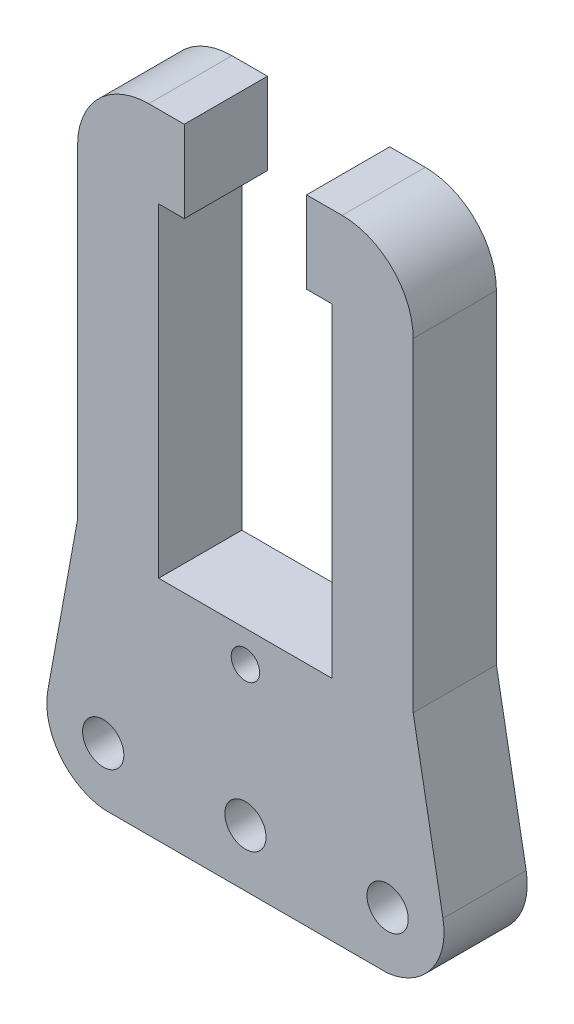
ISO-10303-21;
HEADER;
FILE_DESCRIPTION(('STEP AP214'),'2;1');
FILE_NAME('part.step','',(''),(''),'','','');
FILE_SCHEMA(('AUTOMOTIVE_DESIGN { 1 0 10303 214 1 1 1 1 }'));
ENDSEC;
DATA;
#1=APPLICATION_CONTEXT('core data for automotive mechanical design processes');
#2=APPLICATION_PROTOCOL_DEFINITION('international standard','automotive_design',2000,#1);
#3=PRODUCT_CONTEXT('',#1,'mechanical');
#4=PRODUCT('Part','Part','',(#3));
#5=PRODUCT_RELATED_PRODUCT_CATEGORY('part','',(#4));
#6=PRODUCT_DEFINITION_FORMATION('','',#4);
#7=PRODUCT_DEFINITION_CONTEXT('part definition',#1,'design');
#8=PRODUCT_DEFINITION('design','',#6,#7);
#9=PRODUCT_DEFINITION_SHAPE('','',#8);
#10=(LENGTH_UNIT() NAMED_UNIT(*) SI_UNIT(.MILLI.,.METRE.));
#11=(NAMED_UNIT(*) PLANE_ANGLE_UNIT() SI_UNIT($,.RADIAN.));
#12=(NAMED_UNIT(*) SI_UNIT($,.STERADIAN.) SOLID_ANGLE_UNIT());
#13=UNCERTAINTY_MEASURE_WITH_UNIT(LENGTH_MEASURE(1.E-05),#10,'distance_accuracy_value','');
#14=(GEOMETRIC_REPRESENTATION_CONTEXT(3) GLOBAL_UNCERTAINTY_ASSIGNED_CONTEXT((#13)) GLOBAL_UNIT_ASSIGNED_CONTEXT((#10,
#11,#12)) REPRESENTATION_CONTEXT('',''));
#15=CARTESIAN_POINT('',(0.,0.,0.));
#16=DIRECTION('',(0.,0.,1.));
#17=DIRECTION('',(1.,0.,0.));
#18=AXIS2_PLACEMENT_3D('',#15,#16,#17);
#19=CARTESIAN_POINT('',(513.182236888306,577.734833400792,5.85));
#20=DIRECTION('',(0.,0.,1.));
#21=DIRECTION('',(1.,0.,0.));
#22=AXIS2_PLACEMENT_3D('',#19,#20,#21);
#23=PLANE('',#22);
#24=CARTESIAN_POINT('',(509.982236888306,542.184833400791,5.85));
#25=DIRECTION('',(0.,0.,1.));
#26=DIRECTION('',(-1.,0.,0.));
#27=AXIS2_PLACEMENT_3D('',#24,#25,#26);
#28=CIRCLE('',#27,1.44999999999996);
#29=CARTESIAN_POINT('',(508.532236888306,542.184833400791,5.85));
#30=VERTEX_POINT('',#29);
#31=EDGE_CURVE('E369',#30,#30,#28,.T.);
#32=ORIENTED_EDGE('',*,*,#31,.F.);
#33=EDGE_LOOP('',(#32));
#34=FACE_BOUND('',#33,.T.);
#35=CARTESIAN_POINT('',(519.982236888306,542.184833400791,5.85));
#36=DIRECTION('',(0.,0.,1.));
#37=DIRECTION('',(1.,0.,0.));
#38=AXIS2_PLACEMENT_3D('',#35,#36,#37);
#39=CIRCLE('',#38,1.44999999999996);
#40=CARTESIAN_POINT('',(521.432236888306,542.184833400791,5.85));
#41=VERTEX_POINT('',#40);
#42=EDGE_CURVE('E193',#41,#41,#39,.T.);
#43=ORIENTED_EDGE('',*,*,#42,.F.);
#44=EDGE_LOOP('',(#43));
#45=FACE_BOUND('',#44,.T.);
#46=DIRECTION('',(0.,1.,0.));
#47=VECTOR('',#46,1.);
#48=CARTESIAN_POINT('',(513.882236888306,554.184833400792,5.85));
#49=LINE('',#48,#47);
#50=CARTESIAN_POINT('',(513.882236888306,554.184833400792,5.85));
#51=VERTEX_POINT('',#50);
#52=CARTESIAN_POINT('',(513.882236888306,576.984833400792,5.85));
#53=VERTEX_POINT('',#52);
#54=EDGE_CURVE('E224',#51,#53,#49,.T.);
#55=ORIENTED_EDGE('',*,*,#54,.T.);
#56=DIRECTION('',(1.,0.,0.));
#57=VECTOR('',#56,1.);
#58=CARTESIAN_POINT('',(513.882236888306,576.984833400792,5.85));
#59=LINE('',#58,#57);
#60=CARTESIAN_POINT('',(515.682236888306,576.984833400792,5.85));
#61=VERTEX_POINT('',#60);
#62=EDGE_CURVE('E122',#53,#61,#59,.T.);
#63=ORIENTED_EDGE('',*,*,#62,.T.);
#64=DIRECTION('',(0.,1.,0.));
#65=VECTOR('',#64,1.);
#66=CARTESIAN_POINT('',(515.682236888306,576.984833400792,5.85));
#67=LINE('',#66,#65);
#68=CARTESIAN_POINT('',(515.682236888306,582.734833400792,5.85));
#69=VERTEX_POINT('',#68);
#70=EDGE_CURVE('E269',#61,#69,#67,.T.);
#71=ORIENTED_EDGE('',*,*,#70,.T.);
#72=DIRECTION('',(-1.,0.,0.));
#73=VECTOR('',#72,1.);
#74=CARTESIAN_POINT('',(515.682236888306,582.734833400792,5.85));
#75=LINE('',#74,#73);
#76=CARTESIAN_POINT('',(513.182236888306,582.734833400792,5.85));
#77=VERTEX_POINT('',#76);
#78=EDGE_CURVE('E288',#69,#77,#75,.T.);
#79=ORIENTED_EDGE('',*,*,#78,.T.);
#80=CARTESIAN_POINT('',(513.182236888306,577.734833400792,5.85));
#81=DIRECTION('',(0.,0.,1.));
#82=DIRECTION('',(1.,0.,0.));
#83=AXIS2_PLACEMENT_3D('',#80,#81,#82);
#84=CIRCLE('',#83,5.);
#85=CARTESIAN_POINT('',(508.182236888306,577.734833400792,5.85));
#86=VERTEX_POINT('',#85);
#87=EDGE_CURVE('E285',#77,#86,#84,.T.);
#88=ORIENTED_EDGE('',*,*,#87,.T.);
#89=DIRECTION('',(0.,-1.,0.));
#90=VECTOR('',#89,1.);
#91=CARTESIAN_POINT('',(508.182236888306,577.734833400792,5.85));
#92=LINE('',#91,#90);
#93=CARTESIAN_POINT('',(508.182236888306,554.934833400792,5.85));
#94=VERTEX_POINT('',#93);
#95=EDGE_CURVE('E287',#86,#94,#92,.T.);
#96=ORIENTED_EDGE('',*,*,#95,.T.);
#97=DIRECTION('',(-0.179623399361245,-0.98373544939781,0.));
#98=VECTOR('',#97,1.);
#99=CARTESIAN_POINT('',(508.182236888306,554.934833400792,5.85));
#100=LINE('',#99,#98);
#101=CARTESIAN_POINT('',(506.087301785432,543.461595881551,5.85));
#102=VERTEX_POINT('',#101);
#103=EDGE_CURVE('E290',#94,#102,#100,.T.);
#104=ORIENTED_EDGE('',*,*,#103,.T.);
#105=CARTESIAN_POINT('',(510.514111307723,542.653290584426,5.85));
#106=DIRECTION('',(0.,0.,1.));
#107=DIRECTION('',(1.,0.,0.));
#108=AXIS2_PLACEMENT_3D('',#105,#106,#107);
#109=CIRCLE('',#108,4.50000000000008);
#110=CARTESIAN_POINT('',(509.982236888306,538.184833400791,5.85));
#111=VERTEX_POINT('',#110);
#112=EDGE_CURVE('E296',#102,#111,#109,.T.);
#113=ORIENTED_EDGE('',*,*,#112,.T.);
#114=DIRECTION('',(1.,0.,0.));
#115=VECTOR('',#114,1.);
#116=CARTESIAN_POINT('',(509.982236888306,538.184833400791,5.85));
#117=LINE('',#116,#115);
#118=CARTESIAN_POINT('',(529.982236888306,538.184833400791,5.85));
#119=VERTEX_POINT('',#118);
#120=EDGE_CURVE('E298',#111,#119,#117,.T.);
#121=ORIENTED_EDGE('',*,*,#120,.T.);
#122=CARTESIAN_POINT('',(529.45036246889,542.653290584426,5.85));
#123=DIRECTION('',(0.,0.,1.));
#124=DIRECTION('',(-1.,0.,0.));
#125=AXIS2_PLACEMENT_3D('',#122,#123,#124);
#126=CIRCLE('',#125,4.50000000000008);
#127=CARTESIAN_POINT('',(533.87717199118,543.461595881551,5.85));
#128=VERTEX_POINT('',#127);
#129=EDGE_CURVE('E300',#119,#128,#126,.T.);
#130=ORIENTED_EDGE('',*,*,#129,.T.);
#131=DIRECTION('',(-0.179623399361245,0.98373544939781,0.));
#132=VECTOR('',#131,1.);
#133=CARTESIAN_POINT('',(531.782236888307,554.934833400792,5.85));
#134=LINE('',#133,#132);
#135=CARTESIAN_POINT('',(531.782236888307,554.934833400792,5.85));
#136=VERTEX_POINT('',#135);
#137=EDGE_CURVE('E302',#128,#136,#134,.T.);
#138=ORIENTED_EDGE('',*,*,#137,.T.);
#139=DIRECTION('',(0.,1.,0.));
#140=VECTOR('',#139,1.);
#141=CARTESIAN_POINT('',(531.782236888307,577.734833400792,5.85));
#142=LINE('',#141,#140);
#143=CARTESIAN_POINT('',(531.782236888306,577.734833400792,5.85));
#144=VERTEX_POINT('',#143);
#145=EDGE_CURVE('E304',#136,#144,#142,.T.);
#146=ORIENTED_EDGE('',*,*,#145,.T.);
#147=CARTESIAN_POINT('',(526.782236888306,577.734833400792,5.85));
#148=DIRECTION('',(0.,0.,1.));
#149=DIRECTION('',(-1.,0.,0.));
#150=AXIS2_PLACEMENT_3D('',#147,#148,#149);
#151=CIRCLE('',#150,5.00000000000012);
#152=CARTESIAN_POINT('',(526.782236888306,582.734833400792,5.85));
#153=VERTEX_POINT('',#152);
#154=EDGE_CURVE('E306',#144,#153,#151,.T.);
#155=ORIENTED_EDGE('',*,*,#154,.T.);
#156=DIRECTION('',(-1.,0.,0.));
#157=VECTOR('',#156,1.);
#158=CARTESIAN_POINT('',(524.282236888307,582.734833400792,5.85));
#159=LINE('',#158,#157);
#160=CARTESIAN_POINT('',(524.282236888307,582.734833400792,5.85));
#161=VERTEX_POINT('',#160);
#162=EDGE_CURVE('E308',#153,#161,#159,.T.);
#163=ORIENTED_EDGE('',*,*,#162,.T.);
#164=DIRECTION('',(0.,-1.,0.));
#165=VECTOR('',#164,1.);
#166=CARTESIAN_POINT('',(524.282236888307,576.984833400792,5.85));
#167=LINE('',#166,#165);
#168=CARTESIAN_POINT('',(524.282236888307,576.984833400792,5.85));
#169=VERTEX_POINT('',#168);
#170=EDGE_CURVE('E171',#161,#169,#167,.T.);
#171=ORIENTED_EDGE('',*,*,#170,.T.);
#172=DIRECTION('',(1.,0.,0.));
#173=VECTOR('',#172,1.);
#174=CARTESIAN_POINT('',(526.082236888307,576.984833400792,5.85));
#175=LINE('',#174,#173);
#176=CARTESIAN_POINT('',(526.082236888307,576.984833400792,5.85));
#177=VERTEX_POINT('',#176);
#178=EDGE_CURVE('E165',#169,#177,#175,.T.);
#179=ORIENTED_EDGE('',*,*,#178,.T.);
#180=DIRECTION('',(0.,-1.,0.));
#181=VECTOR('',#180,1.);
#182=CARTESIAN_POINT('',(526.082236888307,554.184833400792,5.85));
#183=LINE('',#182,#181);
#184=CARTESIAN_POINT('',(526.082236888307,554.184833400792,5.85));
#185=VERTEX_POINT('',#184);
#186=EDGE_CURVE('E169',#177,#185,#183,.T.);
#187=ORIENTED_EDGE('',*,*,#186,.T.);
#188=DIRECTION('',(-1.,0.,0.));
#189=VECTOR('',#188,1.);
#190=CARTESIAN_POINT('',(513.882236888306,554.184833400792,5.85));
#191=LINE('',#190,#189);
#192=EDGE_CURVE('E49',#185,#51,#191,.T.);
#193=ORIENTED_EDGE('',*,*,#192,.T.);
#194=EDGE_LOOP('',(#55,#63,#71,#79,#88,#96,#104,#113,#121,#130,#138,#146,#155,#163,#171,#179,
#187,#193));
#195=FACE_BOUND('',#194,.T.);
#196=CARTESIAN_POINT('',(529.982236888306,542.184833400791,5.85));
#197=DIRECTION('',(0.,0.,1.));
#198=DIRECTION('',(1.,0.,0.));
#199=AXIS2_PLACEMENT_3D('',#196,#197,#198);
#200=CIRCLE('',#199,1.44999999999996);
#201=CARTESIAN_POINT('',(531.432236888306,542.184833400791,5.85));
#202=VERTEX_POINT('',#201);
#203=EDGE_CURVE('E375',#202,#202,#200,.T.);
#204=ORIENTED_EDGE('',*,*,#203,.F.);
#205=EDGE_LOOP('',(#204));
#206=FACE_BOUND('',#205,.T.);
#207=CARTESIAN_POINT('',(519.982236888306,551.984833400792,5.85));
#208=DIRECTION('',(0.,0.,1.));
#209=DIRECTION('',(1.,0.,0.));
#210=AXIS2_PLACEMENT_3D('',#207,#208,#209);
#211=CIRCLE('',#210,1.00000000000005);
#212=CARTESIAN_POINT('',(520.982236888306,551.984833400792,5.85));
#213=VERTEX_POINT('',#212);
#214=EDGE_CURVE('E360',#213,#213,#211,.T.);
#215=ORIENTED_EDGE('',*,*,#214,.F.);
#216=EDGE_LOOP('',(#215));
#217=FACE_BOUND('',#216,.T.);
#218=ADVANCED_FACE('F32',(#34,#45,#195,#206,#217),#23,.T.);
#219=CARTESIAN_POINT('',(513.182236888306,577.734833400792,0.));
#220=DIRECTION('',(0.,0.,1.));
#221=DIRECTION('',(1.,0.,0.));
#222=AXIS2_PLACEMENT_3D('',#219,#220,#221);
#223=PLANE('',#222);
#224=CARTESIAN_POINT('',(509.982236888306,542.184833400791,0.));
#225=DIRECTION('',(0.,0.,1.));
#226=DIRECTION('',(-1.,0.,0.));
#227=AXIS2_PLACEMENT_3D('',#224,#225,#226);
#228=CIRCLE('',#227,1.44999999999996);
#229=CARTESIAN_POINT('',(508.532236888306,542.184833400791,0.));
#230=VERTEX_POINT('',#229);
#231=EDGE_CURVE('E366',#230,#230,#228,.T.);
#232=ORIENTED_EDGE('',*,*,#231,.T.);
#233=EDGE_LOOP('',(#232));
#234=FACE_BOUND('',#233,.T.);
#235=CARTESIAN_POINT('',(519.982236888306,542.184833400791,0.));
#236=DIRECTION('',(0.,0.,1.));
#237=DIRECTION('',(1.,0.,0.));
#238=AXIS2_PLACEMENT_3D('',#235,#236,#237);
#239=CIRCLE('',#238,1.44999999999996);
#240=CARTESIAN_POINT('',(521.432236888306,542.184833400791,0.));
#241=VERTEX_POINT('',#240);
#242=EDGE_CURVE('E378',#241,#241,#239,.T.);
#243=ORIENTED_EDGE('',*,*,#242,.T.);
#244=EDGE_LOOP('',(#243));
#245=FACE_BOUND('',#244,.T.);
#246=DIRECTION('',(0.,1.,0.));
#247=VECTOR('',#246,1.);
#248=CARTESIAN_POINT('',(513.882236888306,554.184833400792,0.));
#249=LINE('',#248,#247);
#250=CARTESIAN_POINT('',(513.882236888306,554.184833400792,0.));
#251=VERTEX_POINT('',#250);
#252=CARTESIAN_POINT('',(513.882236888306,576.984833400792,0.));
#253=VERTEX_POINT('',#252);
#254=EDGE_CURVE('E189',#251,#253,#249,.T.);
#255=ORIENTED_EDGE('',*,*,#254,.F.);
#256=DIRECTION('',(-1.,0.,0.));
#257=VECTOR('',#256,1.);
#258=CARTESIAN_POINT('',(513.882236888306,554.184833400792,0.));
#259=LINE('',#258,#257);
#260=CARTESIAN_POINT('',(526.082236888307,554.184833400792,0.));
#261=VERTEX_POINT('',#260);
#262=EDGE_CURVE('E114',#261,#251,#259,.T.);
#263=ORIENTED_EDGE('',*,*,#262,.F.);
#264=DIRECTION('',(0.,-1.,0.));
#265=VECTOR('',#264,1.);
#266=CARTESIAN_POINT('',(526.082236888307,554.184833400792,0.));
#267=LINE('',#266,#265);
#268=CARTESIAN_POINT('',(526.082236888307,576.984833400792,0.));
#269=VERTEX_POINT('',#268);
#270=EDGE_CURVE('E108',#269,#261,#267,.T.);
#271=ORIENTED_EDGE('',*,*,#270,.F.);
#272=DIRECTION('',(1.,0.,0.));
#273=VECTOR('',#272,1.);
#274=CARTESIAN_POINT('',(526.082236888307,576.984833400792,0.));
#275=LINE('',#274,#273);
#276=CARTESIAN_POINT('',(524.282236888307,576.984833400792,0.));
#277=VERTEX_POINT('',#276);
#278=EDGE_CURVE('E179',#277,#269,#275,.T.);
#279=ORIENTED_EDGE('',*,*,#278,.F.);
#280=DIRECTION('',(0.,-1.,0.));
#281=VECTOR('',#280,1.);
#282=CARTESIAN_POINT('',(524.282236888307,576.984833400792,0.));
#283=LINE('',#282,#281);
#284=CARTESIAN_POINT('',(524.282236888307,582.734833400792,0.));
#285=VERTEX_POINT('',#284);
#286=EDGE_CURVE('E219',#285,#277,#283,.T.);
#287=ORIENTED_EDGE('',*,*,#286,.F.);
#288=DIRECTION('',(-1.,0.,0.));
#289=VECTOR('',#288,1.);
#290=CARTESIAN_POINT('',(524.282236888307,582.734833400792,0.));
#291=LINE('',#290,#289);
#292=CARTESIAN_POINT('',(526.782236888306,582.734833400792,0.));
#293=VERTEX_POINT('',#292);
#294=EDGE_CURVE('E217',#293,#285,#291,.T.);
#295=ORIENTED_EDGE('',*,*,#294,.F.);
#296=CARTESIAN_POINT('',(526.782236888306,577.734833400792,0.));
#297=DIRECTION('',(0.,0.,1.));
#298=DIRECTION('',(-1.,0.,0.));
#299=AXIS2_PLACEMENT_3D('',#296,#297,#298);
#300=CIRCLE('',#299,5.00000000000012);
#301=CARTESIAN_POINT('',(531.782236888306,577.734833400792,0.));
#302=VERTEX_POINT('',#301);
#303=EDGE_CURVE('E215',#302,#293,#300,.T.);
#304=ORIENTED_EDGE('',*,*,#303,.F.);
#305=DIRECTION('',(0.,1.,0.));
#306=VECTOR('',#305,1.);
#307=CARTESIAN_POINT('',(531.782236888307,577.734833400792,0.));
#308=LINE('',#307,#306);
#309=CARTESIAN_POINT('',(531.782236888307,554.934833400792,0.));
#310=VERTEX_POINT('',#309);
#311=EDGE_CURVE('E213',#310,#302,#308,.T.);
#312=ORIENTED_EDGE('',*,*,#311,.F.);
#313=DIRECTION('',(-0.179623399361245,0.98373544939781,0.));
#314=VECTOR('',#313,1.);
#315=CARTESIAN_POINT('',(531.782236888307,554.934833400792,0.));
#316=LINE('',#315,#314);
#317=CARTESIAN_POINT('',(533.87717199118,543.461595881551,0.));
#318=VERTEX_POINT('',#317);
#319=EDGE_CURVE('E211',#318,#310,#316,.T.);
#320=ORIENTED_EDGE('',*,*,#319,.F.);
#321=CARTESIAN_POINT('',(529.45036246889,542.653290584426,0.));
#322=DIRECTION('',(0.,0.,1.));
#323=DIRECTION('',(-1.,0.,0.));
#324=AXIS2_PLACEMENT_3D('',#321,#322,#323);
#325=CIRCLE('',#324,4.50000000000008);
#326=CARTESIAN_POINT('',(529.982236888306,538.184833400791,0.));
#327=VERTEX_POINT('',#326);
#328=EDGE_CURVE('E209',#327,#318,#325,.T.);
#329=ORIENTED_EDGE('',*,*,#328,.F.);
#330=DIRECTION('',(1.,0.,0.));
#331=VECTOR('',#330,1.);
#332=CARTESIAN_POINT('',(509.982236888306,538.184833400791,0.));
#333=LINE('',#332,#331);
#334=CARTESIAN_POINT('',(509.982236888306,538.184833400791,0.));
#335=VERTEX_POINT('',#334);
#336=EDGE_CURVE('E207',#335,#327,#333,.T.);
#337=ORIENTED_EDGE('',*,*,#336,.F.);
#338=CARTESIAN_POINT('',(510.514111307723,542.653290584426,0.));
#339=DIRECTION('',(0.,0.,1.));
#340=DIRECTION('',(1.,0.,0.));
#341=AXIS2_PLACEMENT_3D('',#338,#339,#340);
#342=CIRCLE('',#341,4.50000000000008);
#343=CARTESIAN_POINT('',(506.087301785432,543.461595881551,0.));
#344=VERTEX_POINT('',#343);
#345=EDGE_CURVE('E205',#344,#335,#342,.T.);
#346=ORIENTED_EDGE('',*,*,#345,.F.);
#347=DIRECTION('',(-0.179623399361245,-0.98373544939781,0.));
#348=VECTOR('',#347,1.);
#349=CARTESIAN_POINT('',(508.182236888306,554.934833400792,0.));
#350=LINE('',#349,#348);
#351=CARTESIAN_POINT('',(508.182236888306,554.934833400792,0.));
#352=VERTEX_POINT('',#351);
#353=EDGE_CURVE('E203',#352,#344,#350,.T.);
#354=ORIENTED_EDGE('',*,*,#353,.F.);
#355=DIRECTION('',(0.,-1.,0.));
#356=VECTOR('',#355,1.);
#357=CARTESIAN_POINT('',(508.182236888306,577.734833400792,0.));
#358=LINE('',#357,#356);
#359=CARTESIAN_POINT('',(508.182236888306,577.734833400792,0.));
#360=VERTEX_POINT('',#359);
#361=EDGE_CURVE('E201',#360,#352,#358,.T.);
#362=ORIENTED_EDGE('',*,*,#361,.F.);
#363=CARTESIAN_POINT('',(513.182236888306,577.734833400792,0.));
#364=DIRECTION('',(0.,0.,1.));
#365=DIRECTION('',(1.,0.,0.));
#366=AXIS2_PLACEMENT_3D('',#363,#364,#365);
#367=CIRCLE('',#366,5.);
#368=CARTESIAN_POINT('',(513.182236888306,582.734833400792,0.));
#369=VERTEX_POINT('',#368);
#370=EDGE_CURVE('E199',#369,#360,#367,.T.);
#371=ORIENTED_EDGE('',*,*,#370,.F.);
#372=DIRECTION('',(-1.,0.,0.));
#373=VECTOR('',#372,1.);
#374=CARTESIAN_POINT('',(515.682236888306,582.734833400792,0.));
#375=LINE('',#374,#373);
#376=CARTESIAN_POINT('',(515.682236888306,582.734833400792,0.));
#377=VERTEX_POINT('',#376);
#378=EDGE_CURVE('E197',#377,#369,#375,.T.);
#379=ORIENTED_EDGE('',*,*,#378,.F.);
#380=DIRECTION('',(0.,1.,0.));
#381=VECTOR('',#380,1.);
#382=CARTESIAN_POINT('',(515.682236888306,576.984833400792,0.));
#383=LINE('',#382,#381);
#384=CARTESIAN_POINT('',(515.682236888306,576.984833400792,0.));
#385=VERTEX_POINT('',#384);
#386=EDGE_CURVE('E195',#385,#377,#383,.T.);
#387=ORIENTED_EDGE('',*,*,#386,.F.);
#388=DIRECTION('',(1.,0.,0.));
#389=VECTOR('',#388,1.);
#390=CARTESIAN_POINT('',(513.882236888306,576.984833400792,0.));
#391=LINE('',#390,#389);
#392=EDGE_CURVE('E192',#253,#385,#391,.T.);
#393=ORIENTED_EDGE('',*,*,#392,.F.);
#394=EDGE_LOOP('',(#255,#263,#271,#279,#287,#295,#304,#312,#320,#329,#337,#346,#354,#362,#371,
#379,#387,#393));
#395=FACE_BOUND('',#394,.T.);
#396=CARTESIAN_POINT('',(529.982236888306,542.184833400791,0.));
#397=DIRECTION('',(0.,0.,1.));
#398=DIRECTION('',(1.,0.,0.));
#399=AXIS2_PLACEMENT_3D('',#396,#397,#398);
#400=CIRCLE('',#399,1.44999999999996);
#401=CARTESIAN_POINT('',(531.432236888306,542.184833400791,0.));
#402=VERTEX_POINT('',#401);
#403=EDGE_CURVE('E372',#402,#402,#400,.T.);
#404=ORIENTED_EDGE('',*,*,#403,.T.);
#405=EDGE_LOOP('',(#404));
#406=FACE_BOUND('',#405,.T.);
#407=CARTESIAN_POINT('',(519.982236888306,551.984833400792,0.));
#408=DIRECTION('',(0.,0.,1.));
#409=DIRECTION('',(1.,0.,0.));
#410=AXIS2_PLACEMENT_3D('',#407,#408,#409);
#411=CIRCLE('',#410,1.00000000000005);
#412=CARTESIAN_POINT('',(520.982236888306,551.984833400792,0.));
#413=VERTEX_POINT('',#412);
#414=EDGE_CURVE('E363',#413,#413,#411,.T.);
#415=ORIENTED_EDGE('',*,*,#414,.T.);
#416=EDGE_LOOP('',(#415));
#417=FACE_BOUND('',#416,.T.);
#418=ADVANCED_FACE('F273',(#234,#245,#395,#406,#417),#223,.F.);
#419=CARTESIAN_POINT('',(513.882236888306,554.184833400792,5.85));
#420=DIRECTION('',(-1.,0.,0.));
#421=DIRECTION('',(0.,0.,1.));
#422=AXIS2_PLACEMENT_3D('',#419,#420,#421);
#423=PLANE('',#422);
#424=ORIENTED_EDGE('',*,*,#254,.T.);
#425=DIRECTION('',(0.,0.,-1.));
#426=VECTOR('',#425,1.);
#427=CARTESIAN_POINT('',(513.882236888306,576.984833400792,5.85));
#428=LINE('',#427,#426);
#429=EDGE_CURVE('E11',#53,#253,#428,.T.);
#430=ORIENTED_EDGE('',*,*,#429,.F.);
#431=ORIENTED_EDGE('',*,*,#54,.F.);
#432=DIRECTION('',(0.,0.,-1.));
#433=VECTOR('',#432,1.);
#434=CARTESIAN_POINT('',(513.882236888306,554.184833400792,5.85));
#435=LINE('',#434,#433);
#436=EDGE_CURVE('E185',#51,#251,#435,.T.);
#437=ORIENTED_EDGE('',*,*,#436,.T.);
#438=EDGE_LOOP('',(#424,#430,#431,#437));
#439=FACE_BOUND('',#438,.T.);
#440=ADVANCED_FACE('F34',(#439),#423,.F.);
#441=CARTESIAN_POINT('',(513.882236888306,576.984833400792,5.85));
#442=DIRECTION('',(0.,1.,0.));
#443=DIRECTION('',(0.,0.,1.));
#444=AXIS2_PLACEMENT_3D('',#441,#442,#443);
#445=PLANE('',#444);
#446=ORIENTED_EDGE('',*,*,#392,.T.);
#447=DIRECTION('',(0.,0.,-1.));
#448=VECTOR('',#447,1.);
#449=CARTESIAN_POINT('',(515.682236888306,576.984833400792,5.85));
#450=LINE('',#449,#448);
#451=EDGE_CURVE('E41',#61,#385,#450,.T.);
#452=ORIENTED_EDGE('',*,*,#451,.F.);
#453=ORIENTED_EDGE('',*,*,#62,.F.);
#454=ORIENTED_EDGE('',*,*,#429,.T.);
#455=EDGE_LOOP('',(#446,#452,#453,#454));
#456=FACE_BOUND('',#455,.T.);
#457=ADVANCED_FACE('F547',(#456),#445,.F.);
#458=CARTESIAN_POINT('',(515.682236888306,576.984833400792,5.85));
#459=DIRECTION('',(-1.,0.,0.));
#460=DIRECTION('',(0.,0.,1.));
#461=AXIS2_PLACEMENT_3D('',#458,#459,#460);
#462=PLANE('',#461);
#463=ORIENTED_EDGE('',*,*,#386,.T.);
#464=DIRECTION('',(0.,0.,-1.));
#465=VECTOR('',#464,1.);
#466=CARTESIAN_POINT('',(515.682236888306,582.734833400792,5.85));
#467=LINE('',#466,#465);
#468=EDGE_CURVE('E261',#69,#377,#467,.T.);
#469=ORIENTED_EDGE('',*,*,#468,.F.);
#470=ORIENTED_EDGE('',*,*,#70,.F.);
#471=ORIENTED_EDGE('',*,*,#451,.T.);
#472=EDGE_LOOP('',(#463,#469,#470,#471));
#473=FACE_BOUND('',#472,.T.);
#474=ADVANCED_FACE('F267',(#473),#462,.F.);
#475=CARTESIAN_POINT('',(515.682236888306,582.734833400792,5.85));
#476=DIRECTION('',(0.,-1.,0.));
#477=DIRECTION('',(0.,0.,-1.));
#478=AXIS2_PLACEMENT_3D('',#475,#476,#477);
#479=PLANE('',#478);
#480=ORIENTED_EDGE('',*,*,#378,.T.);
#481=DIRECTION('',(0.,0.,-1.));
#482=VECTOR('',#481,1.);
#483=CARTESIAN_POINT('',(513.182236888306,582.734833400792,5.85));
#484=LINE('',#483,#482);
#485=EDGE_CURVE('E258',#77,#369,#484,.T.);
#486=ORIENTED_EDGE('',*,*,#485,.F.);
#487=ORIENTED_EDGE('',*,*,#78,.F.);
#488=ORIENTED_EDGE('',*,*,#468,.T.);
#489=EDGE_LOOP('',(#480,#486,#487,#488));
#490=FACE_BOUND('',#489,.T.);
#491=ADVANCED_FACE('F279',(#490),#479,.F.);
#492=CARTESIAN_POINT('',(513.182236888306,577.734833400792,5.85));
#493=DIRECTION('',(0.,0.,-1.));
#494=DIRECTION('',(-1.,0.,0.));
#495=AXIS2_PLACEMENT_3D('',#492,#493,#494);
#496=CYLINDRICAL_SURFACE('',#495,5.);
#497=ORIENTED_EDGE('',*,*,#370,.T.);
#498=DIRECTION('',(0.,0.,-1.));
#499=VECTOR('',#498,1.);
#500=CARTESIAN_POINT('',(508.182236888306,577.734833400792,5.85));
#501=LINE('',#500,#499);
#502=EDGE_CURVE('E255',#86,#360,#501,.T.);
#503=ORIENTED_EDGE('',*,*,#502,.F.);
#504=ORIENTED_EDGE('',*,*,#87,.F.);
#505=ORIENTED_EDGE('',*,*,#485,.T.);
#506=EDGE_LOOP('',(#497,#503,#504,#505));
#507=FACE_BOUND('',#506,.T.);
#508=ADVANCED_FACE('F283',(#507),#496,.T.);
#509=CARTESIAN_POINT('',(508.182236888306,577.734833400792,5.85));
#510=DIRECTION('',(1.,0.,0.));
#511=DIRECTION('',(0.,0.,-1.));
#512=AXIS2_PLACEMENT_3D('',#509,#510,#511);
#513=PLANE('',#512);
#514=ORIENTED_EDGE('',*,*,#361,.T.);
#515=DIRECTION('',(0.,0.,-1.));
#516=VECTOR('',#515,1.);
#517=CARTESIAN_POINT('',(508.182236888306,554.934833400792,5.85));
#518=LINE('',#517,#516);
#519=EDGE_CURVE('E252',#94,#352,#518,.T.);
#520=ORIENTED_EDGE('',*,*,#519,.F.);
#521=ORIENTED_EDGE('',*,*,#95,.F.);
#522=ORIENTED_EDGE('',*,*,#502,.T.);
#523=EDGE_LOOP('',(#514,#520,#521,#522));
#524=FACE_BOUND('',#523,.T.);
#525=ADVANCED_FACE('F512',(#524),#513,.F.);
#526=CARTESIAN_POINT('',(508.182236888306,554.934833400792,5.85));
#527=DIRECTION('',(0.98373544939781,-0.179623399361246,0.));
#528=DIRECTION('',(0.179623399361246,0.98373544939781,0.));
#529=AXIS2_PLACEMENT_3D('',#526,#527,#528);
#530=PLANE('',#529);
#531=ORIENTED_EDGE('',*,*,#353,.T.);
#532=DIRECTION('',(0.,0.,-1.));
#533=VECTOR('',#532,1.);
#534=CARTESIAN_POINT('',(506.087301785432,543.461595881551,5.85));
#535=LINE('',#534,#533);
#536=EDGE_CURVE('E249',#102,#344,#535,.T.);
#537=ORIENTED_EDGE('',*,*,#536,.F.);
#538=ORIENTED_EDGE('',*,*,#103,.F.);
#539=ORIENTED_EDGE('',*,*,#519,.T.);
#540=EDGE_LOOP('',(#531,#537,#538,#539));
#541=FACE_BOUND('',#540,.T.);
#542=ADVANCED_FACE('F502',(#541),#530,.F.);
#543=CARTESIAN_POINT('',(510.514111307723,542.653290584426,5.85));
#544=DIRECTION('',(0.,0.,-1.));
#545=DIRECTION('',(-1.,0.,0.));
#546=AXIS2_PLACEMENT_3D('',#543,#544,#545);
#547=CYLINDRICAL_SURFACE('',#546,4.50000000000008);
#548=ORIENTED_EDGE('',*,*,#345,.T.);
#549=DIRECTION('',(0.,0.,-1.));
#550=VECTOR('',#549,1.);
#551=CARTESIAN_POINT('',(509.982236888306,538.184833400791,5.85));
#552=LINE('',#551,#550);
#553=EDGE_CURVE('E246',#111,#335,#552,.T.);
#554=ORIENTED_EDGE('',*,*,#553,.F.);
#555=ORIENTED_EDGE('',*,*,#112,.F.);
#556=ORIENTED_EDGE('',*,*,#536,.T.);
#557=EDGE_LOOP('',(#548,#554,#555,#556));
#558=FACE_BOUND('',#557,.T.);
#559=ADVANCED_FACE('F492',(#558),#547,.T.);
#560=CARTESIAN_POINT('',(509.982236888306,538.184833400791,5.85));
#561=DIRECTION('',(0.,1.,0.));
#562=DIRECTION('',(0.,0.,1.));
#563=AXIS2_PLACEMENT_3D('',#560,#561,#562);
#564=PLANE('',#563);
#565=ORIENTED_EDGE('',*,*,#336,.T.);
#566=DIRECTION('',(0.,0.,-1.));
#567=VECTOR('',#566,1.);
#568=CARTESIAN_POINT('',(529.982236888306,538.184833400791,5.85));
#569=LINE('',#568,#567);
#570=EDGE_CURVE('E243',#119,#327,#569,.T.);
#571=ORIENTED_EDGE('',*,*,#570,.F.);
#572=ORIENTED_EDGE('',*,*,#120,.F.);
#573=ORIENTED_EDGE('',*,*,#553,.T.);
#574=EDGE_LOOP('',(#565,#571,#572,#573));
#575=FACE_BOUND('',#574,.T.);
#576=ADVANCED_FACE('F482',(#575),#564,.F.);
#577=CARTESIAN_POINT('',(529.45036246889,542.653290584426,5.85));
#578=DIRECTION('',(0.,0.,-1.));
#579=DIRECTION('',(-1.,0.,0.));
#580=AXIS2_PLACEMENT_3D('',#577,#578,#579);
#581=CYLINDRICAL_SURFACE('',#580,4.50000000000008);
#582=ORIENTED_EDGE('',*,*,#328,.T.);
#583=DIRECTION('',(0.,0.,-1.));
#584=VECTOR('',#583,1.);
#585=CARTESIAN_POINT('',(533.87717199118,543.461595881551,5.85));
#586=LINE('',#585,#584);
#587=EDGE_CURVE('E240',#128,#318,#586,.T.);
#588=ORIENTED_EDGE('',*,*,#587,.F.);
#589=ORIENTED_EDGE('',*,*,#129,.F.);
#590=ORIENTED_EDGE('',*,*,#570,.T.);
#591=EDGE_LOOP('',(#582,#588,#589,#590));
#592=FACE_BOUND('',#591,.T.);
#593=ADVANCED_FACE('F472',(#592),#581,.T.);
#594=CARTESIAN_POINT('',(531.782236888307,554.934833400792,5.85));
#595=DIRECTION('',(-0.98373544939781,-0.179623399361246,0.));
#596=DIRECTION('',(0.179623399361246,-0.98373544939781,0.));
#597=AXIS2_PLACEMENT_3D('',#594,#595,#596);
#598=PLANE('',#597);
#599=ORIENTED_EDGE('',*,*,#319,.T.);
#600=DIRECTION('',(0.,0.,-1.));
#601=VECTOR('',#600,1.);
#602=CARTESIAN_POINT('',(531.782236888307,554.934833400792,5.85));
#603=LINE('',#602,#601);
#604=EDGE_CURVE('E237',#136,#310,#603,.T.);
#605=ORIENTED_EDGE('',*,*,#604,.F.);
#606=ORIENTED_EDGE('',*,*,#137,.F.);
#607=ORIENTED_EDGE('',*,*,#587,.T.);
#608=EDGE_LOOP('',(#599,#605,#606,#607));
#609=FACE_BOUND('',#608,.T.);
#610=ADVANCED_FACE('F462',(#609),#598,.F.);
#611=CARTESIAN_POINT('',(531.782236888307,577.734833400792,5.85));
#612=DIRECTION('',(-1.,0.,0.));
#613=DIRECTION('',(0.,0.,1.));
#614=AXIS2_PLACEMENT_3D('',#611,#612,#613);
#615=PLANE('',#614);
#616=ORIENTED_EDGE('',*,*,#311,.T.);
#617=DIRECTION('',(0.,0.,-1.));
#618=VECTOR('',#617,1.);
#619=CARTESIAN_POINT('',(531.782236888306,577.734833400792,5.85));
#620=LINE('',#619,#618);
#621=EDGE_CURVE('E234',#144,#302,#620,.T.);
#622=ORIENTED_EDGE('',*,*,#621,.F.);
#623=ORIENTED_EDGE('',*,*,#145,.F.);
#624=ORIENTED_EDGE('',*,*,#604,.T.);
#625=EDGE_LOOP('',(#616,#622,#623,#624));
#626=FACE_BOUND('',#625,.T.);
#627=ADVANCED_FACE('F452',(#626),#615,.F.);
#628=CARTESIAN_POINT('',(526.782236888306,577.734833400792,5.85));
#629=DIRECTION('',(0.,0.,-1.));
#630=DIRECTION('',(-1.,0.,0.));
#631=AXIS2_PLACEMENT_3D('',#628,#629,#630);
#632=CYLINDRICAL_SURFACE('',#631,5.00000000000012);
#633=ORIENTED_EDGE('',*,*,#303,.T.);
#634=DIRECTION('',(0.,0.,-1.));
#635=VECTOR('',#634,1.);
#636=CARTESIAN_POINT('',(526.782236888306,582.734833400792,5.85));
#637=LINE('',#636,#635);
#638=EDGE_CURVE('E231',#153,#293,#637,.T.);
#639=ORIENTED_EDGE('',*,*,#638,.F.);
#640=ORIENTED_EDGE('',*,*,#154,.F.);
#641=ORIENTED_EDGE('',*,*,#621,.T.);
#642=EDGE_LOOP('',(#633,#639,#640,#641));
#643=FACE_BOUND('',#642,.T.);
#644=ADVANCED_FACE('F443',(#643),#632,.T.);
#645=CARTESIAN_POINT('',(524.282236888307,582.734833400792,5.85));
#646=DIRECTION('',(0.,-1.,0.));
#647=DIRECTION('',(0.,0.,-1.));
#648=AXIS2_PLACEMENT_3D('',#645,#646,#647);
#649=PLANE('',#648);
#650=ORIENTED_EDGE('',*,*,#294,.T.);
#651=DIRECTION('',(0.,0.,-1.));
#652=VECTOR('',#651,1.);
#653=CARTESIAN_POINT('',(524.282236888307,582.734833400792,5.85));
#654=LINE('',#653,#652);
#655=EDGE_CURVE('E228',#161,#285,#654,.T.);
#656=ORIENTED_EDGE('',*,*,#655,.F.);
#657=ORIENTED_EDGE('',*,*,#162,.F.);
#658=ORIENTED_EDGE('',*,*,#638,.T.);
#659=EDGE_LOOP('',(#650,#656,#657,#658));
#660=FACE_BOUND('',#659,.T.);
#661=ADVANCED_FACE('F314',(#660),#649,.F.);
#662=CARTESIAN_POINT('',(524.282236888307,576.984833400792,5.85));
#663=DIRECTION('',(1.,0.,0.));
#664=DIRECTION('',(0.,0.,-1.));
#665=AXIS2_PLACEMENT_3D('',#662,#663,#664);
#666=PLANE('',#665);
#667=ORIENTED_EDGE('',*,*,#286,.T.);
#668=DIRECTION('',(0.,0.,-1.));
#669=VECTOR('',#668,1.);
#670=CARTESIAN_POINT('',(524.282236888307,576.984833400792,5.85));
#671=LINE('',#670,#669);
#672=EDGE_CURVE('E180',#169,#277,#671,.T.);
#673=ORIENTED_EDGE('',*,*,#672,.F.);
#674=ORIENTED_EDGE('',*,*,#170,.F.);
#675=ORIENTED_EDGE('',*,*,#655,.T.);
#676=EDGE_LOOP('',(#667,#673,#674,#675));
#677=FACE_BOUND('',#676,.T.);
#678=ADVANCED_FACE('F318',(#677),#666,.F.);
#679=CARTESIAN_POINT('',(526.082236888307,576.984833400792,5.85));
#680=DIRECTION('',(0.,1.,0.));
#681=DIRECTION('',(0.,0.,1.));
#682=AXIS2_PLACEMENT_3D('',#679,#680,#681);
#683=PLANE('',#682);
#684=ORIENTED_EDGE('',*,*,#278,.T.);
#685=DIRECTION('',(0.,0.,-1.));
#686=VECTOR('',#685,1.);
#687=CARTESIAN_POINT('',(526.082236888307,576.984833400792,5.85));
#688=LINE('',#687,#686);
#689=EDGE_CURVE('E176',#177,#269,#688,.T.);
#690=ORIENTED_EDGE('',*,*,#689,.F.);
#691=ORIENTED_EDGE('',*,*,#178,.F.);
#692=ORIENTED_EDGE('',*,*,#672,.T.);
#693=EDGE_LOOP('',(#684,#690,#691,#692));
#694=FACE_BOUND('',#693,.T.);
#695=ADVANCED_FACE('F177',(#694),#683,.F.);
#696=CARTESIAN_POINT('',(526.082236888307,554.184833400792,5.85));
#697=DIRECTION('',(1.,0.,0.));
#698=DIRECTION('',(0.,0.,-1.));
#699=AXIS2_PLACEMENT_3D('',#696,#697,#698);
#700=PLANE('',#699);
#701=ORIENTED_EDGE('',*,*,#270,.T.);
#702=DIRECTION('',(0.,0.,-1.));
#703=VECTOR('',#702,1.);
#704=CARTESIAN_POINT('',(526.082236888307,554.184833400792,5.85));
#705=LINE('',#704,#703);
#706=EDGE_CURVE('E181',#185,#261,#705,.T.);
#707=ORIENTED_EDGE('',*,*,#706,.F.);
#708=ORIENTED_EDGE('',*,*,#186,.F.);
#709=ORIENTED_EDGE('',*,*,#689,.T.);
#710=EDGE_LOOP('',(#701,#707,#708,#709));
#711=FACE_BOUND('',#710,.T.);
#712=ADVANCED_FACE('F183',(#711),#700,.F.);
#713=CARTESIAN_POINT('',(513.882236888306,554.184833400792,5.85));
#714=DIRECTION('',(0.,-1.,0.));
#715=DIRECTION('',(0.,0.,-1.));
#716=AXIS2_PLACEMENT_3D('',#713,#714,#715);
#717=PLANE('',#716);
#718=ORIENTED_EDGE('',*,*,#262,.T.);
#719=ORIENTED_EDGE('',*,*,#436,.F.);
#720=ORIENTED_EDGE('',*,*,#192,.F.);
#721=ORIENTED_EDGE('',*,*,#706,.T.);
#722=EDGE_LOOP('',(#718,#719,#720,#721));
#723=FACE_BOUND('',#722,.T.);
#724=ADVANCED_FACE('F322',(#723),#717,.F.);
#725=CARTESIAN_POINT('',(519.982236888306,542.184833400791,5.85));
#726=DIRECTION('',(0.,0.,-1.));
#727=DIRECTION('',(-1.,0.,0.));
#728=AXIS2_PLACEMENT_3D('',#725,#726,#727);
#729=CYLINDRICAL_SURFACE('',#728,1.44999999999996);
#730=ORIENTED_EDGE('',*,*,#42,.T.);
#731=EDGE_LOOP('',(#730));
#732=FACE_BOUND('',#731,.T.);
#733=ORIENTED_EDGE('',*,*,#242,.F.);
#734=EDGE_LOOP('',(#733));
#735=FACE_BOUND('',#734,.T.);
#736=ADVANCED_FACE('F324',(#732,#735),#729,.F.);
#737=CARTESIAN_POINT('',(529.982236888306,542.184833400791,5.85));
#738=DIRECTION('',(0.,0.,-1.));
#739=DIRECTION('',(-1.,0.,0.));
#740=AXIS2_PLACEMENT_3D('',#737,#738,#739);
#741=CYLINDRICAL_SURFACE('',#740,1.44999999999996);
#742=ORIENTED_EDGE('',*,*,#203,.T.);
#743=EDGE_LOOP('',(#742));
#744=FACE_BOUND('',#743,.T.);
#745=ORIENTED_EDGE('',*,*,#403,.F.);
#746=EDGE_LOOP('',(#745));
#747=FACE_BOUND('',#746,.T.);
#748=ADVANCED_FACE('F330',(#744,#747),#741,.F.);
#749=CARTESIAN_POINT('',(509.982236888306,542.184833400791,5.85));
#750=DIRECTION('',(0.,0.,-1.));
#751=DIRECTION('',(-1.,0.,0.));
#752=AXIS2_PLACEMENT_3D('',#749,#750,#751);
#753=CYLINDRICAL_SURFACE('',#752,1.44999999999996);
#754=ORIENTED_EDGE('',*,*,#31,.T.);
#755=EDGE_LOOP('',(#754));
#756=FACE_BOUND('',#755,.T.);
#757=ORIENTED_EDGE('',*,*,#231,.F.);
#758=EDGE_LOOP('',(#757));
#759=FACE_BOUND('',#758,.T.);
#760=ADVANCED_FACE('F347',(#756,#759),#753,.F.);
#761=CARTESIAN_POINT('',(519.982236888306,551.984833400792,5.85));
#762=DIRECTION('',(0.,0.,-1.));
#763=DIRECTION('',(-1.,0.,0.));
#764=AXIS2_PLACEMENT_3D('',#761,#762,#763);
#765=CYLINDRICAL_SURFACE('',#764,1.00000000000005);
#766=ORIENTED_EDGE('',*,*,#214,.T.);
#767=EDGE_LOOP('',(#766));
#768=FACE_BOUND('',#767,.T.);
#769=ORIENTED_EDGE('',*,*,#414,.F.);
#770=EDGE_LOOP('',(#769));
#771=FACE_BOUND('',#770,.T.);
#772=ADVANCED_FACE('F351',(#768,#771),#765,.F.);
#773=CLOSED_SHELL('',(#218,#418,#440,#457,#474,#491,#508,#525,#542,#559,#576,#593,#610,#627,
#644,#661,#678,#695,#712,#724,#736,#748,#760,#772));
#774=MANIFOLD_SOLID_BREP('B2',#773);
#775=ADVANCED_BREP_SHAPE_REPRESENTATION('',(#18,#774),#14);
#776=SHAPE_DEFINITION_REPRESENTATION(#9,#775);
ENDSEC;
END-ISO-10303-21;
